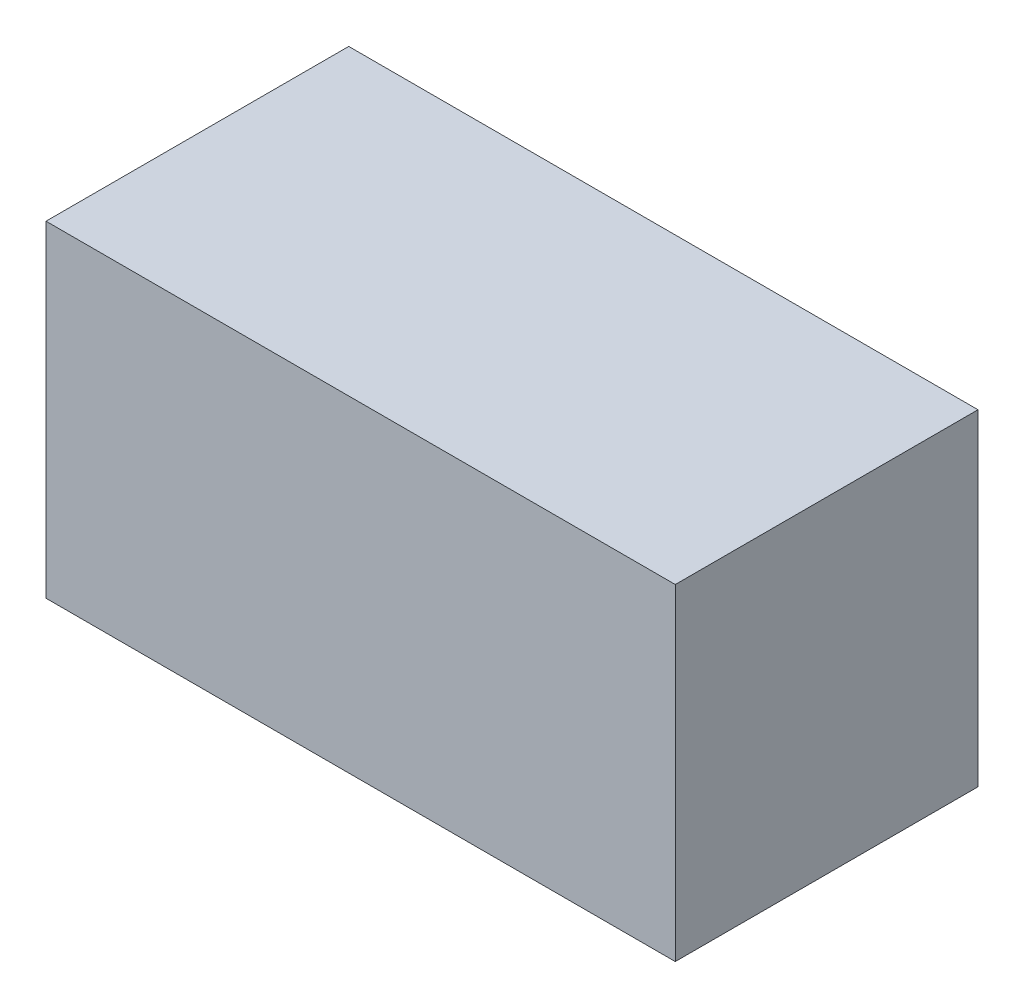
ISO-10303-21;
HEADER;
FILE_DESCRIPTION(('STEP AP214'),'2;1');
FILE_NAME('part.step','',(''),(''),'','','');
FILE_SCHEMA(('AUTOMOTIVE_DESIGN { 1 0 10303 214 1 1 1 1 }'));
ENDSEC;
DATA;
#1=APPLICATION_CONTEXT('core data for automotive mechanical design processes');
#2=APPLICATION_PROTOCOL_DEFINITION('international standard','automotive_design',2000,#1);
#3=PRODUCT_CONTEXT('',#1,'mechanical');
#4=PRODUCT('Part','Part','',(#3));
#5=PRODUCT_RELATED_PRODUCT_CATEGORY('part','',(#4));
#6=PRODUCT_DEFINITION_FORMATION('','',#4);
#7=PRODUCT_DEFINITION_CONTEXT('part definition',#1,'design');
#8=PRODUCT_DEFINITION('design','',#6,#7);
#9=PRODUCT_DEFINITION_SHAPE('','',#8);
#10=(LENGTH_UNIT() NAMED_UNIT(*) SI_UNIT(.MILLI.,.METRE.));
#11=(NAMED_UNIT(*) PLANE_ANGLE_UNIT() SI_UNIT($,.RADIAN.));
#12=(NAMED_UNIT(*) SI_UNIT($,.STERADIAN.) SOLID_ANGLE_UNIT());
#13=UNCERTAINTY_MEASURE_WITH_UNIT(LENGTH_MEASURE(1.E-05),#10,'distance_accuracy_value','');
#14=(GEOMETRIC_REPRESENTATION_CONTEXT(3) GLOBAL_UNCERTAINTY_ASSIGNED_CONTEXT((#13)) GLOBAL_UNIT_ASSIGNED_CONTEXT((#10,
#11,#12)) REPRESENTATION_CONTEXT('',''));
#15=CARTESIAN_POINT('',(0.,0.,0.));
#16=DIRECTION('',(0.,0.,1.));
#17=DIRECTION('',(1.,0.,0.));
#18=AXIS2_PLACEMENT_3D('',#15,#16,#17);
#19=CARTESIAN_POINT('',(-1.3699998,1.3699998,2.54));
#20=DIRECTION('',(1.,0.,0.));
#21=DIRECTION('',(0.,0.,-1.));
#22=AXIS2_PLACEMENT_3D('',#19,#20,#21);
#23=PLANE('',#22);
#24=DIRECTION('',(0.,-1.,0.));
#25=VECTOR('',#24,1.);
#26=CARTESIAN_POINT('',(-1.3699998,1.3699998,0.));
#27=LINE('',#26,#25);
#28=CARTESIAN_POINT('',(-1.3699998,1.3699998,0.));
#29=VERTEX_POINT('',#28);
#30=CARTESIAN_POINT('',(-1.3699998,-1.3699998,0.));
#31=VERTEX_POINT('',#30);
#32=EDGE_CURVE('E95',#29,#31,#27,.T.);
#33=ORIENTED_EDGE('',*,*,#32,.T.);
#34=DIRECTION('',(0.,0.,-1.));
#35=VECTOR('',#34,1.);
#36=CARTESIAN_POINT('',(-1.3699998,-1.3699998,2.54));
#37=LINE('',#36,#35);
#38=CARTESIAN_POINT('',(-1.3699998,-1.3699998,2.54));
#39=VERTEX_POINT('',#38);
#40=EDGE_CURVE('E11',#39,#31,#37,.T.);
#41=ORIENTED_EDGE('',*,*,#40,.F.);
#42=DIRECTION('',(0.,-1.,0.));
#43=VECTOR('',#42,1.);
#44=CARTESIAN_POINT('',(-1.3699998,1.3699998,2.54));
#45=LINE('',#44,#43);
#46=CARTESIAN_POINT('',(-1.3699998,1.3699998,2.54));
#47=VERTEX_POINT('',#46);
#48=EDGE_CURVE('E83',#47,#39,#45,.T.);
#49=ORIENTED_EDGE('',*,*,#48,.F.);
#50=DIRECTION('',(0.,0.,-1.));
#51=VECTOR('',#50,1.);
#52=CARTESIAN_POINT('',(-1.3699998,1.3699998,2.54));
#53=LINE('',#52,#51);
#54=EDGE_CURVE('E91',#47,#29,#53,.T.);
#55=ORIENTED_EDGE('',*,*,#54,.T.);
#56=EDGE_LOOP('',(#33,#41,#49,#55));
#57=FACE_BOUND('',#56,.T.);
#58=ADVANCED_FACE('F32',(#57),#23,.F.);
#59=CARTESIAN_POINT('',(-1.3699998,-1.3699998,2.54));
#60=DIRECTION('',(0.,1.,0.));
#61=DIRECTION('',(0.,0.,1.));
#62=AXIS2_PLACEMENT_3D('',#59,#60,#61);
#63=PLANE('',#62);
#64=DIRECTION('',(1.,0.,0.));
#65=VECTOR('',#64,1.);
#66=CARTESIAN_POINT('',(-1.3699998,-1.3699998,0.));
#67=LINE('',#66,#65);
#68=CARTESIAN_POINT('',(3.9099998,-1.3699998,0.));
#69=VERTEX_POINT('',#68);
#70=EDGE_CURVE('E87',#31,#69,#67,.T.);
#71=ORIENTED_EDGE('',*,*,#70,.T.);
#72=DIRECTION('',(0.,0.,-1.));
#73=VECTOR('',#72,1.);
#74=CARTESIAN_POINT('',(3.9099998,-1.3699998,2.54));
#75=LINE('',#74,#73);
#76=CARTESIAN_POINT('',(3.9099998,-1.3699998,2.54));
#77=VERTEX_POINT('',#76);
#78=EDGE_CURVE('E40',#77,#69,#75,.T.);
#79=ORIENTED_EDGE('',*,*,#78,.F.);
#80=DIRECTION('',(1.,0.,0.));
#81=VECTOR('',#80,1.);
#82=CARTESIAN_POINT('',(-1.3699998,-1.3699998,2.54));
#83=LINE('',#82,#81);
#84=EDGE_CURVE('E78',#39,#77,#83,.T.);
#85=ORIENTED_EDGE('',*,*,#84,.F.);
#86=ORIENTED_EDGE('',*,*,#40,.T.);
#87=EDGE_LOOP('',(#71,#79,#85,#86));
#88=FACE_BOUND('',#87,.T.);
#89=ADVANCED_FACE('F86',(#88),#63,.F.);
#90=CARTESIAN_POINT('',(3.9099998,-1.3699998,2.54));
#91=DIRECTION('',(-1.,0.,0.));
#92=DIRECTION('',(0.,0.,1.));
#93=AXIS2_PLACEMENT_3D('',#90,#91,#92);
#94=PLANE('',#93);
#95=DIRECTION('',(0.,1.,0.));
#96=VECTOR('',#95,1.);
#97=CARTESIAN_POINT('',(3.9099998,-1.3699998,0.));
#98=LINE('',#97,#96);
#99=CARTESIAN_POINT('',(3.9099998,1.3699998,0.));
#100=VERTEX_POINT('',#99);
#101=EDGE_CURVE('E65',#69,#100,#98,.T.);
#102=ORIENTED_EDGE('',*,*,#101,.T.);
#103=DIRECTION('',(0.,0.,-1.));
#104=VECTOR('',#103,1.);
#105=CARTESIAN_POINT('',(3.9099998,1.3699998,2.54));
#106=LINE('',#105,#104);
#107=CARTESIAN_POINT('',(3.9099998,1.3699998,2.54));
#108=VERTEX_POINT('',#107);
#109=EDGE_CURVE('E88',#108,#100,#106,.T.);
#110=ORIENTED_EDGE('',*,*,#109,.F.);
#111=DIRECTION('',(0.,1.,0.));
#112=VECTOR('',#111,1.);
#113=CARTESIAN_POINT('',(3.9099998,-1.3699998,2.54));
#114=LINE('',#113,#112);
#115=EDGE_CURVE('E81',#77,#108,#114,.T.);
#116=ORIENTED_EDGE('',*,*,#115,.F.);
#117=ORIENTED_EDGE('',*,*,#78,.T.);
#118=EDGE_LOOP('',(#102,#110,#116,#117));
#119=FACE_BOUND('',#118,.T.);
#120=ADVANCED_FACE('F89',(#119),#94,.F.);
#121=CARTESIAN_POINT('',(3.9099998,1.3699998,2.54));
#122=DIRECTION('',(0.,-1.,0.));
#123=DIRECTION('',(0.,0.,-1.));
#124=AXIS2_PLACEMENT_3D('',#121,#122,#123);
#125=PLANE('',#124);
#126=DIRECTION('',(-1.,0.,0.));
#127=VECTOR('',#126,1.);
#128=CARTESIAN_POINT('',(3.9099998,1.3699998,0.));
#129=LINE('',#128,#127);
#130=EDGE_CURVE('E71',#100,#29,#129,.T.);
#131=ORIENTED_EDGE('',*,*,#130,.T.);
#132=ORIENTED_EDGE('',*,*,#54,.F.);
#133=DIRECTION('',(-1.,0.,0.));
#134=VECTOR('',#133,1.);
#135=CARTESIAN_POINT('',(3.9099998,1.3699998,2.54));
#136=LINE('',#135,#134);
#137=EDGE_CURVE('E48',#108,#47,#136,.T.);
#138=ORIENTED_EDGE('',*,*,#137,.F.);
#139=ORIENTED_EDGE('',*,*,#109,.T.);
#140=EDGE_LOOP('',(#131,#132,#138,#139));
#141=FACE_BOUND('',#140,.T.);
#142=ADVANCED_FACE('F102',(#141),#125,.F.);
#143=CARTESIAN_POINT('',(0.,0.,2.54));
#144=DIRECTION('',(0.,0.,1.));
#145=DIRECTION('',(1.,0.,0.));
#146=AXIS2_PLACEMENT_3D('',#143,#144,#145);
#147=PLANE('',#146);
#148=ORIENTED_EDGE('',*,*,#48,.T.);
#149=ORIENTED_EDGE('',*,*,#84,.T.);
#150=ORIENTED_EDGE('',*,*,#115,.T.);
#151=ORIENTED_EDGE('',*,*,#137,.T.);
#152=EDGE_LOOP('',(#148,#149,#150,#151));
#153=FACE_BOUND('',#152,.T.);
#154=ADVANCED_FACE('F79',(#153),#147,.T.);
#155=CARTESIAN_POINT('',(0.,0.,0.));
#156=DIRECTION('',(0.,0.,1.));
#157=DIRECTION('',(1.,0.,0.));
#158=AXIS2_PLACEMENT_3D('',#155,#156,#157);
#159=PLANE('',#158);
#160=ORIENTED_EDGE('',*,*,#32,.F.);
#161=ORIENTED_EDGE('',*,*,#130,.F.);
#162=ORIENTED_EDGE('',*,*,#101,.F.);
#163=ORIENTED_EDGE('',*,*,#70,.F.);
#164=EDGE_LOOP('',(#160,#161,#162,#163));
#165=FACE_BOUND('',#164,.T.);
#166=ADVANCED_FACE('F105',(#165),#159,.F.);
#167=CLOSED_SHELL('',(#58,#89,#120,#142,#154,#166));
#168=MANIFOLD_SOLID_BREP('B2',#167);
#169=ADVANCED_BREP_SHAPE_REPRESENTATION('',(#18,#168),#14);
#170=SHAPE_DEFINITION_REPRESENTATION(#9,#169);
ENDSEC;
END-ISO-10303-21;
